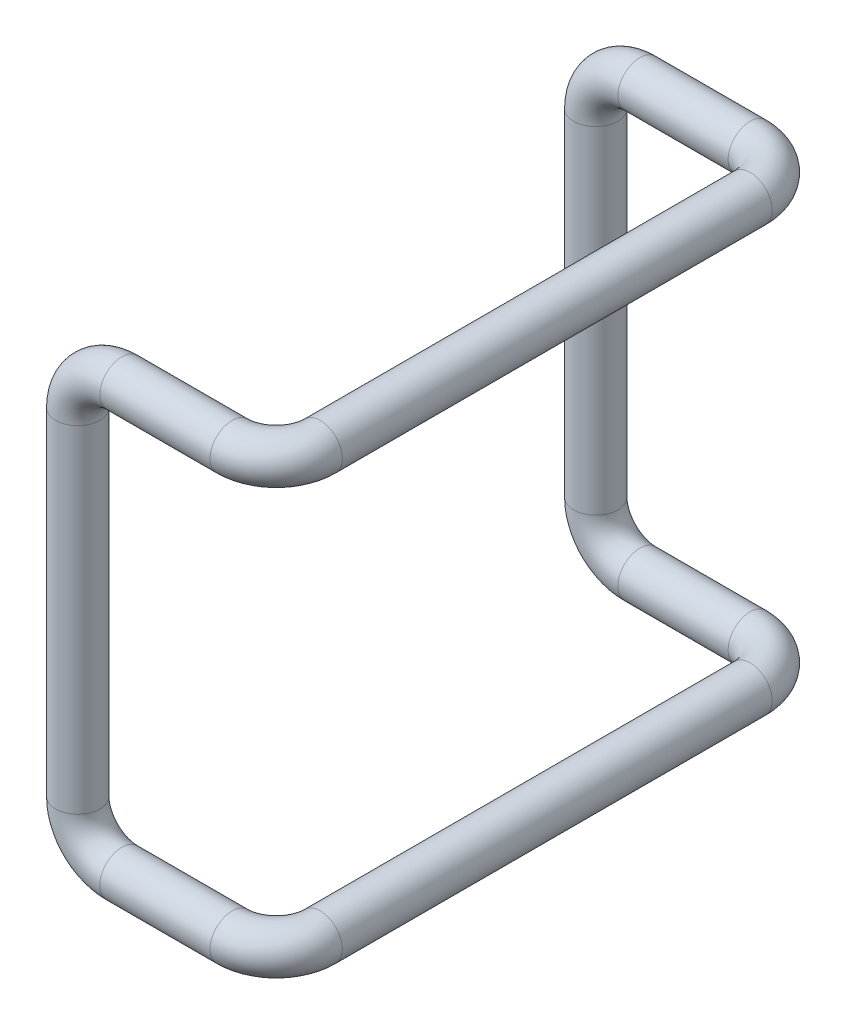
ISO-10303-21;
HEADER;
FILE_DESCRIPTION(('STEP AP214'),'2;1');
FILE_NAME('part.step','',(''),(''),'','','');
FILE_SCHEMA(('AUTOMOTIVE_DESIGN { 1 0 10303 214 1 1 1 1 }'));
ENDSEC;
DATA;
#1=APPLICATION_CONTEXT('core data for automotive mechanical design processes');
#2=APPLICATION_PROTOCOL_DEFINITION('international standard','automotive_design',2000,#1);
#3=PRODUCT_CONTEXT('',#1,'mechanical');
#4=PRODUCT('Part','Part','',(#3));
#5=PRODUCT_RELATED_PRODUCT_CATEGORY('part','',(#4));
#6=PRODUCT_DEFINITION_FORMATION('','',#4);
#7=PRODUCT_DEFINITION_CONTEXT('part definition',#1,'design');
#8=PRODUCT_DEFINITION('design','',#6,#7);
#9=PRODUCT_DEFINITION_SHAPE('','',#8);
#10=(LENGTH_UNIT() NAMED_UNIT(*) SI_UNIT(.MILLI.,.METRE.));
#11=(NAMED_UNIT(*) PLANE_ANGLE_UNIT() SI_UNIT($,.RADIAN.));
#12=(NAMED_UNIT(*) SI_UNIT($,.STERADIAN.) SOLID_ANGLE_UNIT());
#13=UNCERTAINTY_MEASURE_WITH_UNIT(LENGTH_MEASURE(1.E-05),#10,'distance_accuracy_value','');
#14=(GEOMETRIC_REPRESENTATION_CONTEXT(3) GLOBAL_UNCERTAINTY_ASSIGNED_CONTEXT((#13)) GLOBAL_UNIT_ASSIGNED_CONTEXT((#10,
#11,#12)) REPRESENTATION_CONTEXT('',''));
#15=CARTESIAN_POINT('',(0.,0.,0.));
#16=DIRECTION('',(0.,0.,1.));
#17=DIRECTION('',(1.,0.,0.));
#18=AXIS2_PLACEMENT_3D('',#15,#16,#17);
#19=CARTESIAN_POINT('',(8.89,12.23137,-12.37742));
#20=DIRECTION('',(0.,-1.,0.));
#21=DIRECTION('',(0.,0.,-1.));
#22=AXIS2_PLACEMENT_3D('',#19,#20,#21);
#23=TOROIDAL_SURFACE('',#22,2.54000000000003,1.27);
#24=CARTESIAN_POINT('',(8.89,12.23137,-14.91742));
#25=DIRECTION('',(1.,0.,0.));
#26=DIRECTION('',(0.,0.,-1.));
#27=AXIS2_PLACEMENT_3D('',#24,#25,#26);
#28=CIRCLE('',#27,1.27);
#29=CARTESIAN_POINT('',(8.89,12.23137,-16.18742));
#30=VERTEX_POINT('',#29);
#31=EDGE_CURVE('E36',#30,#30,#28,.T.);
#32=CARTESIAN_POINT('',(11.43,12.23137,-12.37742));
#33=DIRECTION('',(0.,0.,1.));
#34=DIRECTION('',(1.,0.,0.));
#35=AXIS2_PLACEMENT_3D('',#32,#33,#34);
#36=CIRCLE('',#35,1.27);
#37=CARTESIAN_POINT('',(12.7,12.23137,-12.37742));
#38=VERTEX_POINT('',#37);
#39=EDGE_CURVE('E10',#38,#38,#36,.T.);
#40=CARTESIAN_POINT('',(8.89,12.23137,-12.37742));
#41=DIRECTION('',(0.,-1.,0.));
#42=DIRECTION('',(0.,0.,-1.));
#43=AXIS2_PLACEMENT_3D('',#40,#41,#42);
#44=CIRCLE('',#43,3.81000000000003);
#45=EDGE_CURVE('',#30,#38,#44,.T.);
#46=ORIENTED_EDGE('',*,*,#31,.T.);
#47=ORIENTED_EDGE('',*,*,#39,.F.);
#48=ORIENTED_EDGE('',*,*,#45,.T.);
#49=ORIENTED_EDGE('',*,*,#45,.F.);
#50=EDGE_LOOP('',(#46,#48,#47,#49));
#51=FACE_BOUND('',#50,.T.);
#52=ADVANCED_FACE('F30',(#51),#23,.T.);
#53=CARTESIAN_POINT('',(2.54,12.23137,-14.91742));
#54=DIRECTION('',(1.,0.,0.));
#55=DIRECTION('',(0.,0.,-1.));
#56=AXIS2_PLACEMENT_3D('',#53,#54,#55);
#57=CYLINDRICAL_SURFACE('',#56,1.27);
#58=CARTESIAN_POINT('',(2.54,12.23137,-14.91742));
#59=DIRECTION('',(1.,0.,0.));
#60=DIRECTION('',(0.,0.,-1.));
#61=AXIS2_PLACEMENT_3D('',#58,#59,#60);
#62=CIRCLE('',#61,1.27);
#63=CARTESIAN_POINT('',(2.54000000000001,13.50137,-14.91742));
#64=VERTEX_POINT('',#63);
#65=EDGE_CURVE('E40',#64,#64,#62,.T.);
#66=ORIENTED_EDGE('',*,*,#65,.T.);
#67=EDGE_LOOP('',(#66));
#68=FACE_BOUND('',#67,.T.);
#69=ORIENTED_EDGE('',*,*,#31,.F.);
#70=EDGE_LOOP('',(#69));
#71=FACE_BOUND('',#70,.T.);
#72=ADVANCED_FACE('F98',(#68,#71),#57,.T.);
#73=CARTESIAN_POINT('',(2.54,9.69136999999999,-14.91742));
#74=DIRECTION('',(0.,0.,-1.));
#75=DIRECTION('',(-1.,0.,0.));
#76=AXIS2_PLACEMENT_3D('',#73,#74,#75);
#77=TOROIDAL_SURFACE('',#76,2.54,1.27);
#78=CARTESIAN_POINT('',(0.,9.69136999999999,-14.91742));
#79=DIRECTION('',(0.,1.,0.));
#80=DIRECTION('',(0.,0.,-1.));
#81=AXIS2_PLACEMENT_3D('',#78,#79,#80);
#82=CIRCLE('',#81,1.27);
#83=CARTESIAN_POINT('',(-1.27,9.69136999999999,-14.91742));
#84=VERTEX_POINT('',#83);
#85=EDGE_CURVE('E44',#84,#84,#82,.T.);
#86=CARTESIAN_POINT('',(2.54,9.69136999999999,-14.91742));
#87=DIRECTION('',(0.,0.,-1.));
#88=DIRECTION('',(-1.,0.,0.));
#89=AXIS2_PLACEMENT_3D('',#86,#87,#88);
#90=CIRCLE('',#89,3.81);
#91=EDGE_CURVE('',#84,#64,#90,.T.);
#92=ORIENTED_EDGE('',*,*,#85,.T.);
#93=ORIENTED_EDGE('',*,*,#65,.F.);
#94=ORIENTED_EDGE('',*,*,#91,.T.);
#95=ORIENTED_EDGE('',*,*,#91,.F.);
#96=EDGE_LOOP('',(#92,#94,#93,#95));
#97=FACE_BOUND('',#96,.T.);
#98=ADVANCED_FACE('F102',(#97),#77,.T.);
#99=CARTESIAN_POINT('',(0.,-9.69137,-14.91742));
#100=DIRECTION('',(0.,1.,0.));
#101=DIRECTION('',(0.,0.,1.));
#102=AXIS2_PLACEMENT_3D('',#99,#100,#101);
#103=CYLINDRICAL_SURFACE('',#102,1.27);
#104=CARTESIAN_POINT('',(0.,-9.69137,-14.91742));
#105=DIRECTION('',(0.,1.,0.));
#106=DIRECTION('',(0.,0.,-1.));
#107=AXIS2_PLACEMENT_3D('',#104,#105,#106);
#108=CIRCLE('',#107,1.27);
#109=CARTESIAN_POINT('',(-1.27,-9.69137,-14.91742));
#110=VERTEX_POINT('',#109);
#111=EDGE_CURVE('E49',#110,#110,#108,.T.);
#112=ORIENTED_EDGE('',*,*,#111,.T.);
#113=EDGE_LOOP('',(#112));
#114=FACE_BOUND('',#113,.T.);
#115=ORIENTED_EDGE('',*,*,#85,.F.);
#116=EDGE_LOOP('',(#115));
#117=FACE_BOUND('',#116,.T.);
#118=ADVANCED_FACE('F108',(#114,#117),#103,.T.);
#119=CARTESIAN_POINT('',(2.54,-9.69137000000001,-14.91742));
#120=DIRECTION('',(0.,0.,-1.));
#121=DIRECTION('',(0.,1.,0.));
#122=AXIS2_PLACEMENT_3D('',#119,#120,#121);
#123=TOROIDAL_SURFACE('',#122,2.54,1.27);
#124=CARTESIAN_POINT('',(2.54,-12.23137,-14.91742));
#125=DIRECTION('',(-1.,0.,0.));
#126=DIRECTION('',(0.,0.,-1.));
#127=AXIS2_PLACEMENT_3D('',#124,#125,#126);
#128=CIRCLE('',#127,1.27);
#129=CARTESIAN_POINT('',(2.54,-13.50137,-14.91742));
#130=VERTEX_POINT('',#129);
#131=EDGE_CURVE('E52',#130,#130,#128,.T.);
#132=CARTESIAN_POINT('',(2.54,-9.69137000000001,-14.91742));
#133=DIRECTION('',(0.,0.,-1.));
#134=DIRECTION('',(0.,1.,0.));
#135=AXIS2_PLACEMENT_3D('',#132,#133,#134);
#136=CIRCLE('',#135,3.81);
#137=EDGE_CURVE('',#130,#110,#136,.T.);
#138=ORIENTED_EDGE('',*,*,#131,.T.);
#139=ORIENTED_EDGE('',*,*,#111,.F.);
#140=ORIENTED_EDGE('',*,*,#137,.T.);
#141=ORIENTED_EDGE('',*,*,#137,.F.);
#142=EDGE_LOOP('',(#138,#140,#139,#141));
#143=FACE_BOUND('',#142,.T.);
#144=ADVANCED_FACE('F115',(#143),#123,.T.);
#145=CARTESIAN_POINT('',(8.88999999999999,-12.23137,-14.91742));
#146=DIRECTION('',(-1.,0.,0.));
#147=DIRECTION('',(0.,0.,1.));
#148=AXIS2_PLACEMENT_3D('',#145,#146,#147);
#149=CYLINDRICAL_SURFACE('',#148,1.27);
#150=CARTESIAN_POINT('',(8.88999999999999,-12.23137,-14.91742));
#151=DIRECTION('',(-1.,0.,0.));
#152=DIRECTION('',(0.,0.,-1.));
#153=AXIS2_PLACEMENT_3D('',#150,#151,#152);
#154=CIRCLE('',#153,1.27);
#155=CARTESIAN_POINT('',(8.88999999999999,-12.23137,-16.18742));
#156=VERTEX_POINT('',#155);
#157=EDGE_CURVE('E55',#156,#156,#154,.T.);
#158=ORIENTED_EDGE('',*,*,#157,.T.);
#159=EDGE_LOOP('',(#158));
#160=FACE_BOUND('',#159,.T.);
#161=ORIENTED_EDGE('',*,*,#131,.F.);
#162=EDGE_LOOP('',(#161));
#163=FACE_BOUND('',#162,.T.);
#164=ADVANCED_FACE('F119',(#160,#163),#149,.T.);
#165=CARTESIAN_POINT('',(8.89,-12.23137,-12.37742));
#166=DIRECTION('',(0.,1.,0.));
#167=DIRECTION('',(0.,0.,1.));
#168=AXIS2_PLACEMENT_3D('',#165,#166,#167);
#169=TOROIDAL_SURFACE('',#168,2.53999999999999,1.27);
#170=CARTESIAN_POINT('',(11.43,-12.23137,-12.37742));
#171=DIRECTION('',(0.,0.,-1.));
#172=DIRECTION('',(1.,0.,0.));
#173=AXIS2_PLACEMENT_3D('',#170,#171,#172);
#174=CIRCLE('',#173,1.27);
#175=CARTESIAN_POINT('',(12.7,-12.23137,-12.37742));
#176=VERTEX_POINT('',#175);
#177=EDGE_CURVE('E58',#176,#176,#174,.T.);
#178=CARTESIAN_POINT('',(8.89,-12.23137,-12.37742));
#179=DIRECTION('',(0.,1.,0.));
#180=DIRECTION('',(0.,0.,1.));
#181=AXIS2_PLACEMENT_3D('',#178,#179,#180);
#182=CIRCLE('',#181,3.80999999999999);
#183=EDGE_CURVE('',#176,#156,#182,.T.);
#184=ORIENTED_EDGE('',*,*,#177,.T.);
#185=ORIENTED_EDGE('',*,*,#157,.F.);
#186=ORIENTED_EDGE('',*,*,#183,.T.);
#187=ORIENTED_EDGE('',*,*,#183,.F.);
#188=EDGE_LOOP('',(#184,#186,#185,#187));
#189=FACE_BOUND('',#188,.T.);
#190=ADVANCED_FACE('F123',(#189),#169,.T.);
#191=CARTESIAN_POINT('',(11.43,-12.23137,12.37742));
#192=DIRECTION('',(0.,0.,-1.));
#193=DIRECTION('',(-1.,0.,0.));
#194=AXIS2_PLACEMENT_3D('',#191,#192,#193);
#195=CYLINDRICAL_SURFACE('',#194,1.27);
#196=CARTESIAN_POINT('',(11.43,-12.23137,12.37742));
#197=DIRECTION('',(0.,0.,-1.));
#198=DIRECTION('',(1.,0.,0.));
#199=AXIS2_PLACEMENT_3D('',#196,#197,#198);
#200=CIRCLE('',#199,1.27);
#201=CARTESIAN_POINT('',(12.7,-12.23137,12.37742));
#202=VERTEX_POINT('',#201);
#203=EDGE_CURVE('E61',#202,#202,#200,.T.);
#204=ORIENTED_EDGE('',*,*,#203,.T.);
#205=EDGE_LOOP('',(#204));
#206=FACE_BOUND('',#205,.T.);
#207=ORIENTED_EDGE('',*,*,#177,.F.);
#208=EDGE_LOOP('',(#207));
#209=FACE_BOUND('',#208,.T.);
#210=ADVANCED_FACE('F127',(#206,#209),#195,.T.);
#211=CARTESIAN_POINT('',(8.89,-12.23137,12.37742));
#212=DIRECTION('',(0.,1.,0.));
#213=DIRECTION('',(0.,0.,1.));
#214=AXIS2_PLACEMENT_3D('',#211,#212,#213);
#215=TOROIDAL_SURFACE('',#214,2.53999999999999,1.27);
#216=CARTESIAN_POINT('',(8.89,-12.23137,14.91742));
#217=DIRECTION('',(1.,0.,0.));
#218=DIRECTION('',(0.,0.,1.));
#219=AXIS2_PLACEMENT_3D('',#216,#217,#218);
#220=CIRCLE('',#219,1.27);
#221=CARTESIAN_POINT('',(8.89,-12.23137,16.18742));
#222=VERTEX_POINT('',#221);
#223=EDGE_CURVE('E64',#222,#222,#220,.T.);
#224=CARTESIAN_POINT('',(8.89,-12.23137,12.37742));
#225=DIRECTION('',(0.,1.,0.));
#226=DIRECTION('',(0.,0.,1.));
#227=AXIS2_PLACEMENT_3D('',#224,#225,#226);
#228=CIRCLE('',#227,3.80999999999999);
#229=EDGE_CURVE('',#222,#202,#228,.T.);
#230=ORIENTED_EDGE('',*,*,#223,.T.);
#231=ORIENTED_EDGE('',*,*,#203,.F.);
#232=ORIENTED_EDGE('',*,*,#229,.T.);
#233=ORIENTED_EDGE('',*,*,#229,.F.);
#234=EDGE_LOOP('',(#230,#232,#231,#233));
#235=FACE_BOUND('',#234,.T.);
#236=ADVANCED_FACE('F131',(#235),#215,.T.);
#237=CARTESIAN_POINT('',(2.54000000000001,-12.23137,14.91742));
#238=DIRECTION('',(1.,0.,0.));
#239=DIRECTION('',(0.,0.,-1.));
#240=AXIS2_PLACEMENT_3D('',#237,#238,#239);
#241=CYLINDRICAL_SURFACE('',#240,1.27);
#242=CARTESIAN_POINT('',(2.54000000000001,-12.23137,14.91742));
#243=DIRECTION('',(1.,0.,0.));
#244=DIRECTION('',(0.,0.,1.));
#245=AXIS2_PLACEMENT_3D('',#242,#243,#244);
#246=CIRCLE('',#245,1.27);
#247=CARTESIAN_POINT('',(2.54000000000001,-13.50137,14.91742));
#248=VERTEX_POINT('',#247);
#249=EDGE_CURVE('E67',#248,#248,#246,.T.);
#250=ORIENTED_EDGE('',*,*,#249,.T.);
#251=EDGE_LOOP('',(#250));
#252=FACE_BOUND('',#251,.T.);
#253=ORIENTED_EDGE('',*,*,#223,.F.);
#254=EDGE_LOOP('',(#253));
#255=FACE_BOUND('',#254,.T.);
#256=ADVANCED_FACE('F135',(#252,#255),#241,.T.);
#257=CARTESIAN_POINT('',(2.54,-9.69137000000001,14.91742));
#258=DIRECTION('',(0.,0.,1.));
#259=DIRECTION('',(1.,0.,0.));
#260=AXIS2_PLACEMENT_3D('',#257,#258,#259);
#261=TOROIDAL_SURFACE('',#260,2.54,1.27);
#262=CARTESIAN_POINT('',(0.,-9.69137000000001,14.91742));
#263=DIRECTION('',(0.,-1.,0.));
#264=DIRECTION('',(0.,0.,1.));
#265=AXIS2_PLACEMENT_3D('',#262,#263,#264);
#266=CIRCLE('',#265,1.27);
#267=CARTESIAN_POINT('',(-1.27,-9.69137000000001,14.91742));
#268=VERTEX_POINT('',#267);
#269=EDGE_CURVE('E70',#268,#268,#266,.T.);
#270=CARTESIAN_POINT('',(2.54,-9.69137000000001,14.91742));
#271=DIRECTION('',(0.,0.,1.));
#272=DIRECTION('',(1.,0.,0.));
#273=AXIS2_PLACEMENT_3D('',#270,#271,#272);
#274=CIRCLE('',#273,3.81);
#275=EDGE_CURVE('',#268,#248,#274,.T.);
#276=ORIENTED_EDGE('',*,*,#269,.T.);
#277=ORIENTED_EDGE('',*,*,#249,.F.);
#278=ORIENTED_EDGE('',*,*,#275,.T.);
#279=ORIENTED_EDGE('',*,*,#275,.F.);
#280=EDGE_LOOP('',(#276,#278,#277,#279));
#281=FACE_BOUND('',#280,.T.);
#282=ADVANCED_FACE('F139',(#281),#261,.T.);
#283=CARTESIAN_POINT('',(0.,9.69136999999998,14.91742));
#284=DIRECTION('',(0.,-1.,0.));
#285=DIRECTION('',(0.,0.,-1.));
#286=AXIS2_PLACEMENT_3D('',#283,#284,#285);
#287=CYLINDRICAL_SURFACE('',#286,1.27);
#288=CARTESIAN_POINT('',(0.,9.69136999999998,14.91742));
#289=DIRECTION('',(0.,-1.,0.));
#290=DIRECTION('',(0.,0.,1.));
#291=AXIS2_PLACEMENT_3D('',#288,#289,#290);
#292=CIRCLE('',#291,1.27);
#293=CARTESIAN_POINT('',(-1.27,9.69136999999998,14.91742));
#294=VERTEX_POINT('',#293);
#295=EDGE_CURVE('E73',#294,#294,#292,.T.);
#296=ORIENTED_EDGE('',*,*,#295,.T.);
#297=EDGE_LOOP('',(#296));
#298=FACE_BOUND('',#297,.T.);
#299=ORIENTED_EDGE('',*,*,#269,.F.);
#300=EDGE_LOOP('',(#299));
#301=FACE_BOUND('',#300,.T.);
#302=ADVANCED_FACE('F143',(#298,#301),#287,.T.);
#303=CARTESIAN_POINT('',(2.54000000000001,9.69136999999999,14.91742));
#304=DIRECTION('',(0.,0.,1.));
#305=DIRECTION('',(1.,0.,0.));
#306=AXIS2_PLACEMENT_3D('',#303,#304,#305);
#307=TOROIDAL_SURFACE('',#306,2.54,1.27);
#308=CARTESIAN_POINT('',(2.54,12.23137,14.91742));
#309=DIRECTION('',(-1.,0.,0.));
#310=DIRECTION('',(0.,0.,1.));
#311=AXIS2_PLACEMENT_3D('',#308,#309,#310);
#312=CIRCLE('',#311,1.27);
#313=CARTESIAN_POINT('',(2.54,13.50137,14.91742));
#314=VERTEX_POINT('',#313);
#315=EDGE_CURVE('E76',#314,#314,#312,.T.);
#316=CARTESIAN_POINT('',(2.54000000000001,9.69136999999999,14.91742));
#317=DIRECTION('',(0.,0.,1.));
#318=DIRECTION('',(1.,0.,0.));
#319=AXIS2_PLACEMENT_3D('',#316,#317,#318);
#320=CIRCLE('',#319,3.81);
#321=EDGE_CURVE('',#314,#294,#320,.T.);
#322=ORIENTED_EDGE('',*,*,#315,.T.);
#323=ORIENTED_EDGE('',*,*,#295,.F.);
#324=ORIENTED_EDGE('',*,*,#321,.T.);
#325=ORIENTED_EDGE('',*,*,#321,.F.);
#326=EDGE_LOOP('',(#322,#324,#323,#325));
#327=FACE_BOUND('',#326,.T.);
#328=ADVANCED_FACE('F147',(#327),#307,.T.);
#329=CARTESIAN_POINT('',(8.89,12.23137,14.91742));
#330=DIRECTION('',(-1.,0.,0.));
#331=DIRECTION('',(0.,0.,1.));
#332=AXIS2_PLACEMENT_3D('',#329,#330,#331);
#333=CYLINDRICAL_SURFACE('',#332,1.27);
#334=CARTESIAN_POINT('',(8.89,12.23137,14.91742));
#335=DIRECTION('',(-1.,0.,0.));
#336=DIRECTION('',(0.,0.,1.));
#337=AXIS2_PLACEMENT_3D('',#334,#335,#336);
#338=CIRCLE('',#337,1.27);
#339=CARTESIAN_POINT('',(8.89,12.23137,16.18742));
#340=VERTEX_POINT('',#339);
#341=EDGE_CURVE('E79',#340,#340,#338,.T.);
#342=ORIENTED_EDGE('',*,*,#341,.T.);
#343=EDGE_LOOP('',(#342));
#344=FACE_BOUND('',#343,.T.);
#345=ORIENTED_EDGE('',*,*,#315,.F.);
#346=EDGE_LOOP('',(#345));
#347=FACE_BOUND('',#346,.T.);
#348=ADVANCED_FACE('F95',(#344,#347),#333,.T.);
#349=CARTESIAN_POINT('',(8.89,12.23137,12.37742));
#350=DIRECTION('',(0.,-1.,0.));
#351=DIRECTION('',(0.,0.,-1.));
#352=AXIS2_PLACEMENT_3D('',#349,#350,#351);
#353=TOROIDAL_SURFACE('',#352,2.54,1.27);
#354=CARTESIAN_POINT('',(11.43,12.23137,12.37742));
#355=DIRECTION('',(0.,0.,1.));
#356=DIRECTION('',(1.,0.,0.));
#357=AXIS2_PLACEMENT_3D('',#354,#355,#356);
#358=CIRCLE('',#357,1.27);
#359=CARTESIAN_POINT('',(12.7,12.23137,12.37742));
#360=VERTEX_POINT('',#359);
#361=EDGE_CURVE('E82',#360,#360,#358,.T.);
#362=CARTESIAN_POINT('',(8.89,12.23137,12.37742));
#363=DIRECTION('',(0.,-1.,0.));
#364=DIRECTION('',(0.,0.,-1.));
#365=AXIS2_PLACEMENT_3D('',#362,#363,#364);
#366=CIRCLE('',#365,3.81);
#367=EDGE_CURVE('',#360,#340,#366,.T.);
#368=ORIENTED_EDGE('',*,*,#361,.T.);
#369=ORIENTED_EDGE('',*,*,#341,.F.);
#370=ORIENTED_EDGE('',*,*,#367,.T.);
#371=ORIENTED_EDGE('',*,*,#367,.F.);
#372=EDGE_LOOP('',(#368,#370,#369,#371));
#373=FACE_BOUND('',#372,.T.);
#374=ADVANCED_FACE('F86',(#373),#353,.T.);
#375=CARTESIAN_POINT('',(11.43,12.23137,12.37742));
#376=DIRECTION('',(0.,0.,-1.));
#377=DIRECTION('',(-1.,0.,0.));
#378=AXIS2_PLACEMENT_3D('',#375,#376,#377);
#379=CYLINDRICAL_SURFACE('',#378,1.27);
#380=ORIENTED_EDGE('',*,*,#361,.F.);
#381=EDGE_LOOP('',(#380));
#382=FACE_BOUND('',#381,.T.);
#383=ORIENTED_EDGE('',*,*,#39,.T.);
#384=EDGE_LOOP('',(#383));
#385=FACE_BOUND('',#384,.T.);
#386=ADVANCED_FACE('F89',(#382,#385),#379,.T.);
#387=CLOSED_SHELL('',(#52,#72,#98,#118,#144,#164,#190,#210,#236,#256,#282,#302,#328,#348,#374,#386));
#388=MANIFOLD_SOLID_BREP('B2',#387);
#389=ADVANCED_BREP_SHAPE_REPRESENTATION('',(#18,#388),#14);
#390=SHAPE_DEFINITION_REPRESENTATION(#9,#389);
ENDSEC;
END-ISO-10303-21;
